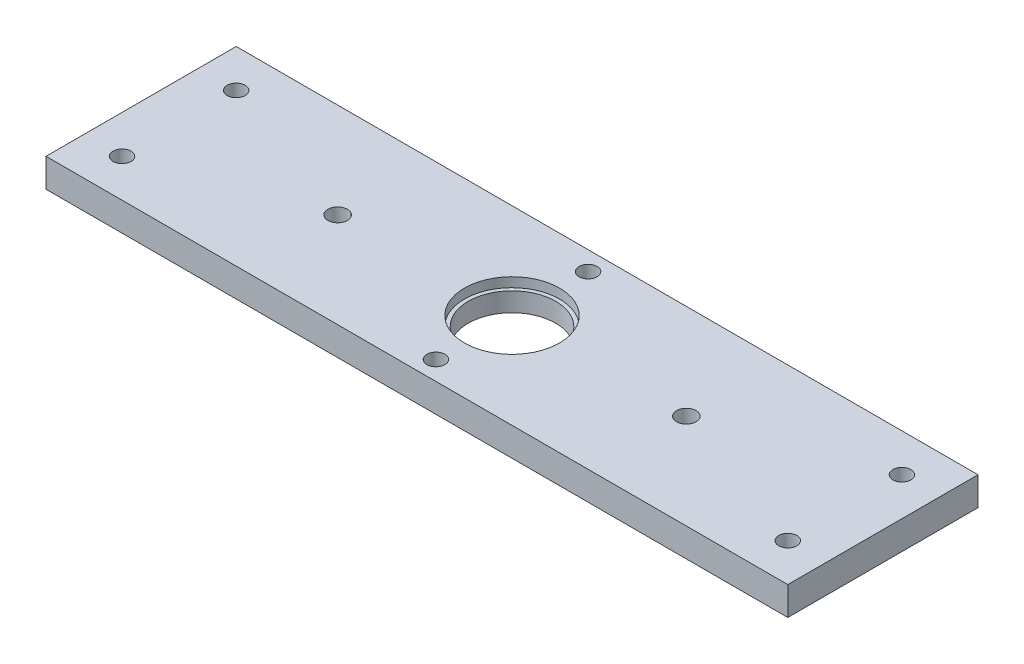
ISO-10303-21;
HEADER;
FILE_DESCRIPTION(('STEP AP214'),'2;1');
FILE_NAME('part.step','',(''),(''),'','','');
FILE_SCHEMA(('AUTOMOTIVE_DESIGN { 1 0 10303 214 1 1 1 1 }'));
ENDSEC;
DATA;
#1=APPLICATION_CONTEXT('core data for automotive mechanical design processes');
#2=APPLICATION_PROTOCOL_DEFINITION('international standard','automotive_design',2000,#1);
#3=PRODUCT_CONTEXT('',#1,'mechanical');
#4=PRODUCT('Part','Part','',(#3));
#5=PRODUCT_RELATED_PRODUCT_CATEGORY('part','',(#4));
#6=PRODUCT_DEFINITION_FORMATION('','',#4);
#7=PRODUCT_DEFINITION_CONTEXT('part definition',#1,'design');
#8=PRODUCT_DEFINITION('design','',#6,#7);
#9=PRODUCT_DEFINITION_SHAPE('','',#8);
#10=(LENGTH_UNIT() NAMED_UNIT(*) SI_UNIT(.MILLI.,.METRE.));
#11=(NAMED_UNIT(*) PLANE_ANGLE_UNIT() SI_UNIT($,.RADIAN.));
#12=(NAMED_UNIT(*) SI_UNIT($,.STERADIAN.) SOLID_ANGLE_UNIT());
#13=UNCERTAINTY_MEASURE_WITH_UNIT(LENGTH_MEASURE(1.E-05),#10,'distance_accuracy_value','');
#14=(GEOMETRIC_REPRESENTATION_CONTEXT(3) GLOBAL_UNCERTAINTY_ASSIGNED_CONTEXT((#13)) GLOBAL_UNIT_ASSIGNED_CONTEXT((#10,
#11,#12)) REPRESENTATION_CONTEXT('',''));
#15=CARTESIAN_POINT('',(0.,0.,0.));
#16=DIRECTION('',(0.,0.,1.));
#17=DIRECTION('',(1.,0.,0.));
#18=AXIS2_PLACEMENT_3D('',#15,#16,#17);
#19=CARTESIAN_POINT('',(0.,0.,0.));
#20=DIRECTION('',(0.,1.,0.));
#21=DIRECTION('',(0.,0.,1.));
#22=AXIS2_PLACEMENT_3D('',#19,#20,#21);
#23=CYLINDRICAL_SURFACE('',#22,14.605);
#24=CARTESIAN_POINT('',(0.,0.,0.));
#25=DIRECTION('',(0.,1.,0.));
#26=DIRECTION('',(0.,0.,1.));
#27=AXIS2_PLACEMENT_3D('',#24,#25,#26);
#28=CIRCLE('',#27,14.605);
#29=CARTESIAN_POINT('',(0.,0.,14.605));
#30=VERTEX_POINT('',#29);
#31=EDGE_CURVE('E104',#30,#30,#28,.T.);
#32=CARTESIAN_POINT('',(0.,6.35,0.));
#33=DIRECTION('',(0.,1.,0.));
#34=DIRECTION('',(0.,0.,1.));
#35=AXIS2_PLACEMENT_3D('',#32,#33,#34);
#36=CIRCLE('',#35,14.605);
#37=CARTESIAN_POINT('',(0.,6.35,14.605));
#38=VERTEX_POINT('',#37);
#39=EDGE_CURVE('E39',#38,#38,#36,.F.);
#40=CARTESIAN_POINT('',(0.,0.,14.605));
#41=CARTESIAN_POINT('',(0.,0.0661458333333333,14.605));
#42=CARTESIAN_POINT('',(0.,0.132291666666667,14.605));
#43=CARTESIAN_POINT('',(0.,0.264583333333333,14.605));
#44=CARTESIAN_POINT('',(0.,0.330729166666667,14.605));
#45=CARTESIAN_POINT('',(0.,0.463020833333333,14.605));
#46=CARTESIAN_POINT('',(0.,0.529166666666667,14.605));
#47=CARTESIAN_POINT('',(0.,0.661458333333333,14.605));
#48=CARTESIAN_POINT('',(0.,0.727604166666667,14.605));
#49=CARTESIAN_POINT('',(0.,0.859895833333333,14.605));
#50=CARTESIAN_POINT('',(0.,0.926041666666667,14.605));
#51=CARTESIAN_POINT('',(0.,1.05833333333333,14.605));
#52=CARTESIAN_POINT('',(0.,1.12447916666667,14.605));
#53=CARTESIAN_POINT('',(0.,1.25677083333333,14.605));
#54=CARTESIAN_POINT('',(0.,1.32291666666667,14.605));
#55=CARTESIAN_POINT('',(0.,1.45520833333333,14.605));
#56=CARTESIAN_POINT('',(0.,1.52135416666667,14.605));
#57=CARTESIAN_POINT('',(0.,1.65364583333333,14.605));
#58=CARTESIAN_POINT('',(0.,1.71979166666667,14.605));
#59=CARTESIAN_POINT('',(0.,1.85208333333333,14.605));
#60=CARTESIAN_POINT('',(0.,1.91822916666667,14.605));
#61=CARTESIAN_POINT('',(0.,2.05052083333333,14.605));
#62=CARTESIAN_POINT('',(0.,2.11666666666667,14.605));
#63=CARTESIAN_POINT('',(0.,2.24895833333333,14.605));
#64=CARTESIAN_POINT('',(0.,2.31510416666667,14.605));
#65=CARTESIAN_POINT('',(0.,2.44739583333333,14.605));
#66=CARTESIAN_POINT('',(0.,2.51354166666667,14.605));
#67=CARTESIAN_POINT('',(0.,2.64583333333333,14.605));
#68=CARTESIAN_POINT('',(0.,2.71197916666667,14.605));
#69=CARTESIAN_POINT('',(0.,2.84427083333333,14.605));
#70=CARTESIAN_POINT('',(0.,2.91041666666667,14.605));
#71=CARTESIAN_POINT('',(0.,3.04270833333333,14.605));
#72=CARTESIAN_POINT('',(0.,3.10885416666667,14.605));
#73=CARTESIAN_POINT('',(0.,3.24114583333333,14.605));
#74=CARTESIAN_POINT('',(0.,3.30729166666667,14.605));
#75=CARTESIAN_POINT('',(0.,3.43958333333333,14.605));
#76=CARTESIAN_POINT('',(0.,3.50572916666667,14.605));
#77=CARTESIAN_POINT('',(0.,3.63802083333333,14.605));
#78=CARTESIAN_POINT('',(0.,3.70416666666667,14.605));
#79=CARTESIAN_POINT('',(0.,3.83645833333333,14.605));
#80=CARTESIAN_POINT('',(0.,3.90260416666667,14.605));
#81=CARTESIAN_POINT('',(0.,4.03489583333333,14.605));
#82=CARTESIAN_POINT('',(0.,4.10104166666667,14.605));
#83=CARTESIAN_POINT('',(0.,4.23333333333333,14.605));
#84=CARTESIAN_POINT('',(0.,4.29947916666667,14.605));
#85=CARTESIAN_POINT('',(0.,4.43177083333333,14.605));
#86=CARTESIAN_POINT('',(0.,4.49791666666667,14.605));
#87=CARTESIAN_POINT('',(0.,4.63020833333333,14.605));
#88=CARTESIAN_POINT('',(0.,4.69635416666667,14.605));
#89=CARTESIAN_POINT('',(0.,4.82864583333333,14.605));
#90=CARTESIAN_POINT('',(0.,4.89479166666667,14.605));
#91=CARTESIAN_POINT('',(0.,5.02708333333333,14.605));
#92=CARTESIAN_POINT('',(0.,5.09322916666667,14.605));
#93=CARTESIAN_POINT('',(0.,5.22552083333333,14.605));
#94=CARTESIAN_POINT('',(0.,5.29166666666667,14.605));
#95=CARTESIAN_POINT('',(0.,5.42395833333333,14.605));
#96=CARTESIAN_POINT('',(0.,5.49010416666667,14.605));
#97=CARTESIAN_POINT('',(0.,5.62239583333333,14.605));
#98=CARTESIAN_POINT('',(0.,5.68854166666667,14.605));
#99=CARTESIAN_POINT('',(0.,5.82083333333333,14.605));
#100=CARTESIAN_POINT('',(0.,5.88697916666667,14.605));
#101=CARTESIAN_POINT('',(0.,6.01927083333333,14.605));
#102=CARTESIAN_POINT('',(0.,6.08541666666667,14.605));
#103=CARTESIAN_POINT('',(0.,6.21770833333333,14.605));
#104=CARTESIAN_POINT('',(0.,6.28385416666667,14.605));
#105=CARTESIAN_POINT('',(0.,6.35,14.605));
#106=B_SPLINE_CURVE_WITH_KNOTS('',3,(#40,#41,#42,#43,#44,#45,#46,#47,#48,#49,#50,#51,#52,#53,
#54,#55,#56,#57,#58,#59,#60,#61,#62,#63,#64,#65,#66,#67,#68,#69,#70,#71,#72,#73,#74,#75,#76,#77,
#78,#79,#80,#81,#82,#83,#84,#85,#86,#87,#88,#89,#90,#91,#92,#93,#94,#95,#96,#97,#98,#99,#100,
#101,#102,#103,#104,#105),.UNSPECIFIED.,.F.,.F.,(4,2,2,2,2,2,2,2,2,2,2,2,2,2,2,2,2,2,2,2,2,2,2,
2,2,2,2,2,2,2,2,2,4),(0.,0.1984375,0.396875,0.5953125,0.79375,0.9921875,1.190625,1.3890625,
1.5875,1.7859375,1.984375,2.1828125,2.38125,2.5796875,2.778125,2.9765625,3.175,3.3734375,
3.571875,3.7703125,3.96875,4.1671875,4.365625,4.5640625,4.7625,4.9609375,5.159375,5.3578125,
5.55625,5.7546875,5.953125,6.1515625,6.35),.UNSPECIFIED.);
#107=EDGE_CURVE('BSEAM35',#30,#38,#106,.T.);
#108=ORIENTED_EDGE('',*,*,#31,.F.);
#109=ORIENTED_EDGE('',*,*,#39,.F.);
#110=ORIENTED_EDGE('',*,*,#107,.T.);
#111=ORIENTED_EDGE('',*,*,#107,.F.);
#112=EDGE_LOOP('',(#108,#110,#109,#111));
#113=FACE_BOUND('',#112,.T.);
#114=ADVANCED_FACE('F35',(#113),#23,.F.);
#115=CARTESIAN_POINT('',(123.825,9.525,31.75));
#116=DIRECTION('',(-1.,0.,0.));
#117=DIRECTION('',(0.,0.,1.));
#118=AXIS2_PLACEMENT_3D('',#115,#116,#117);
#119=PLANE('',#118);
#120=DIRECTION('',(0.,0.,-1.));
#121=VECTOR('',#120,1.);
#122=CARTESIAN_POINT('',(123.825,0.,31.75));
#123=LINE('',#122,#121);
#124=CARTESIAN_POINT('',(123.825,0.,31.75));
#125=VERTEX_POINT('',#124);
#126=CARTESIAN_POINT('',(123.825,0.,-31.75));
#127=VERTEX_POINT('',#126);
#128=EDGE_CURVE('E101',#125,#127,#123,.T.);
#129=ORIENTED_EDGE('',*,*,#128,.T.);
#130=DIRECTION('',(0.,-1.,0.));
#131=VECTOR('',#130,1.);
#132=CARTESIAN_POINT('',(123.825,9.525,-31.75));
#133=LINE('',#132,#131);
#134=CARTESIAN_POINT('',(123.825,9.525,-31.75));
#135=VERTEX_POINT('',#134);
#136=EDGE_CURVE('E11',#135,#127,#133,.T.);
#137=ORIENTED_EDGE('',*,*,#136,.F.);
#138=DIRECTION('',(0.,0.,-1.));
#139=VECTOR('',#138,1.);
#140=CARTESIAN_POINT('',(123.825,9.525,31.75));
#141=LINE('',#140,#139);
#142=CARTESIAN_POINT('',(123.825,9.525,31.75));
#143=VERTEX_POINT('',#142);
#144=EDGE_CURVE('E88',#143,#135,#141,.T.);
#145=ORIENTED_EDGE('',*,*,#144,.F.);
#146=DIRECTION('',(0.,-1.,0.));
#147=VECTOR('',#146,1.);
#148=CARTESIAN_POINT('',(123.825,9.525,31.75));
#149=LINE('',#148,#147);
#150=EDGE_CURVE('E97',#143,#125,#149,.T.);
#151=ORIENTED_EDGE('',*,*,#150,.T.);
#152=EDGE_LOOP('',(#129,#137,#145,#151));
#153=FACE_BOUND('',#152,.T.);
#154=ADVANCED_FACE('F37',(#153),#119,.F.);
#155=CARTESIAN_POINT('',(-123.825,9.525,-31.75));
#156=DIRECTION('',(0.,0.,1.));
#157=DIRECTION('',(1.,0.,0.));
#158=AXIS2_PLACEMENT_3D('',#155,#156,#157);
#159=PLANE('',#158);
#160=DIRECTION('',(-1.,0.,0.));
#161=VECTOR('',#160,1.);
#162=CARTESIAN_POINT('',(-123.825,0.,-31.75));
#163=LINE('',#162,#161);
#164=CARTESIAN_POINT('',(-123.825,0.,-31.75));
#165=VERTEX_POINT('',#164);
#166=EDGE_CURVE('E92',#127,#165,#163,.T.);
#167=ORIENTED_EDGE('',*,*,#166,.T.);
#168=DIRECTION('',(0.,-1.,0.));
#169=VECTOR('',#168,1.);
#170=CARTESIAN_POINT('',(-123.825,9.525,-31.75));
#171=LINE('',#170,#169);
#172=CARTESIAN_POINT('',(-123.825,9.525,-31.75));
#173=VERTEX_POINT('',#172);
#174=EDGE_CURVE('E45',#173,#165,#171,.T.);
#175=ORIENTED_EDGE('',*,*,#174,.F.);
#176=DIRECTION('',(-1.,0.,0.));
#177=VECTOR('',#176,1.);
#178=CARTESIAN_POINT('',(-123.825,9.525,-31.75));
#179=LINE('',#178,#177);
#180=EDGE_CURVE('E83',#135,#173,#179,.T.);
#181=ORIENTED_EDGE('',*,*,#180,.F.);
#182=ORIENTED_EDGE('',*,*,#136,.T.);
#183=EDGE_LOOP('',(#167,#175,#181,#182));
#184=FACE_BOUND('',#183,.T.);
#185=ADVANCED_FACE('F91',(#184),#159,.F.);
#186=CARTESIAN_POINT('',(-123.825,9.525,31.75));
#187=DIRECTION('',(1.,0.,0.));
#188=DIRECTION('',(0.,0.,-1.));
#189=AXIS2_PLACEMENT_3D('',#186,#187,#188);
#190=PLANE('',#189);
#191=DIRECTION('',(0.,0.,1.));
#192=VECTOR('',#191,1.);
#193=CARTESIAN_POINT('',(-123.825,0.,31.75));
#194=LINE('',#193,#192);
#195=CARTESIAN_POINT('',(-123.825,0.,31.75));
#196=VERTEX_POINT('',#195);
#197=EDGE_CURVE('E70',#165,#196,#194,.T.);
#198=ORIENTED_EDGE('',*,*,#197,.T.);
#199=DIRECTION('',(0.,-1.,0.));
#200=VECTOR('',#199,1.);
#201=CARTESIAN_POINT('',(-123.825,9.525,31.75));
#202=LINE('',#201,#200);
#203=CARTESIAN_POINT('',(-123.825,9.525,31.75));
#204=VERTEX_POINT('',#203);
#205=EDGE_CURVE('E93',#204,#196,#202,.T.);
#206=ORIENTED_EDGE('',*,*,#205,.F.);
#207=DIRECTION('',(0.,0.,1.));
#208=VECTOR('',#207,1.);
#209=CARTESIAN_POINT('',(-123.825,9.525,31.75));
#210=LINE('',#209,#208);
#211=EDGE_CURVE('E86',#173,#204,#210,.T.);
#212=ORIENTED_EDGE('',*,*,#211,.F.);
#213=ORIENTED_EDGE('',*,*,#174,.T.);
#214=EDGE_LOOP('',(#198,#206,#212,#213));
#215=FACE_BOUND('',#214,.T.);
#216=ADVANCED_FACE('F95',(#215),#190,.F.);
#217=CARTESIAN_POINT('',(-123.825,9.525,31.75));
#218=DIRECTION('',(0.,0.,-1.));
#219=DIRECTION('',(-1.,0.,0.));
#220=AXIS2_PLACEMENT_3D('',#217,#218,#219);
#221=PLANE('',#220);
#222=DIRECTION('',(1.,0.,0.));
#223=VECTOR('',#222,1.);
#224=CARTESIAN_POINT('',(-123.825,0.,31.75));
#225=LINE('',#224,#223);
#226=EDGE_CURVE('E76',#196,#125,#225,.T.);
#227=ORIENTED_EDGE('',*,*,#226,.T.);
#228=ORIENTED_EDGE('',*,*,#150,.F.);
#229=DIRECTION('',(1.,0.,0.));
#230=VECTOR('',#229,1.);
#231=CARTESIAN_POINT('',(-123.825,9.525,31.75));
#232=LINE('',#231,#230);
#233=EDGE_CURVE('E53',#204,#143,#232,.T.);
#234=ORIENTED_EDGE('',*,*,#233,.F.);
#235=ORIENTED_EDGE('',*,*,#205,.T.);
#236=EDGE_LOOP('',(#227,#228,#234,#235));
#237=FACE_BOUND('',#236,.T.);
#238=ADVANCED_FACE('F109',(#237),#221,.F.);
#239=CARTESIAN_POINT('',(0.,9.525,0.));
#240=DIRECTION('',(0.,-1.,0.));
#241=DIRECTION('',(0.,0.,-1.));
#242=AXIS2_PLACEMENT_3D('',#239,#240,#241);
#243=PLANE('',#242);
#244=CARTESIAN_POINT('',(-111.125,9.525,-19.05));
#245=DIRECTION('',(0.,1.,0.));
#246=DIRECTION('',(0.,0.,1.));
#247=AXIS2_PLACEMENT_3D('',#244,#245,#246);
#248=CIRCLE('',#247,2.99999999999999);
#249=CARTESIAN_POINT('',(-111.125,9.525,-16.05));
#250=VERTEX_POINT('',#249);
#251=EDGE_CURVE('E168',#250,#250,#248,.T.);
#252=ORIENTED_EDGE('',*,*,#251,.F.);
#253=EDGE_LOOP('',(#252));
#254=FACE_BOUND('',#253,.T.);
#255=CARTESIAN_POINT('',(-111.125,9.525,19.05));
#256=DIRECTION('',(0.,1.,0.));
#257=DIRECTION('',(0.,0.,1.));
#258=AXIS2_PLACEMENT_3D('',#255,#256,#257);
#259=CIRCLE('',#258,2.99999999999999);
#260=CARTESIAN_POINT('',(-111.125,9.525,22.05));
#261=VERTEX_POINT('',#260);
#262=EDGE_CURVE('E162',#261,#261,#259,.T.);
#263=ORIENTED_EDGE('',*,*,#262,.F.);
#264=EDGE_LOOP('',(#263));
#265=FACE_BOUND('',#264,.T.);
#266=CARTESIAN_POINT('',(111.125,9.525,19.05));
#267=DIRECTION('',(0.,1.,0.));
#268=DIRECTION('',(0.,0.,1.));
#269=AXIS2_PLACEMENT_3D('',#266,#267,#268);
#270=CIRCLE('',#269,2.99999999999999);
#271=CARTESIAN_POINT('',(111.125,9.525,22.05));
#272=VERTEX_POINT('',#271);
#273=EDGE_CURVE('E156',#272,#272,#270,.T.);
#274=ORIENTED_EDGE('',*,*,#273,.F.);
#275=EDGE_LOOP('',(#274));
#276=FACE_BOUND('',#275,.T.);
#277=CARTESIAN_POINT('',(111.125,9.525,-19.05));
#278=DIRECTION('',(0.,1.,0.));
#279=DIRECTION('',(0.,0.,1.));
#280=AXIS2_PLACEMENT_3D('',#277,#278,#279);
#281=CIRCLE('',#280,2.99999999999999);
#282=CARTESIAN_POINT('',(111.125,9.525,-16.05));
#283=VERTEX_POINT('',#282);
#284=EDGE_CURVE('E150',#283,#283,#281,.T.);
#285=ORIENTED_EDGE('',*,*,#284,.F.);
#286=EDGE_LOOP('',(#285));
#287=FACE_BOUND('',#286,.T.);
#288=CARTESIAN_POINT('',(0.,9.525,0.));
#289=DIRECTION('',(0.,1.,0.));
#290=DIRECTION('',(0.,0.,1.));
#291=AXIS2_PLACEMENT_3D('',#288,#289,#290);
#292=CIRCLE('',#291,15.875);
#293=CARTESIAN_POINT('',(0.,9.525,15.875));
#294=VERTEX_POINT('',#293);
#295=EDGE_CURVE('E141',#294,#294,#292,.T.);
#296=ORIENTED_EDGE('',*,*,#295,.F.);
#297=EDGE_LOOP('',(#296));
#298=FACE_BOUND('',#297,.T.);
#299=CARTESIAN_POINT('',(-58.2083333333333,9.525,0.));
#300=DIRECTION('',(0.,-1.,0.));
#301=DIRECTION('',(0.,0.,-1.));
#302=AXIS2_PLACEMENT_3D('',#299,#300,#301);
#303=CIRCLE('',#302,3.25);
#304=CARTESIAN_POINT('',(-58.2083333333333,9.525,-3.25));
#305=VERTEX_POINT('',#304);
#306=EDGE_CURVE('E135',#305,#305,#303,.T.);
#307=ORIENTED_EDGE('',*,*,#306,.T.);
#308=EDGE_LOOP('',(#307));
#309=FACE_BOUND('',#308,.T.);
#310=CARTESIAN_POINT('',(58.2083333333333,9.525,0.));
#311=DIRECTION('',(0.,-1.,0.));
#312=DIRECTION('',(0.,0.,-1.));
#313=AXIS2_PLACEMENT_3D('',#310,#311,#312);
#314=CIRCLE('',#313,3.25);
#315=CARTESIAN_POINT('',(58.2083333333333,9.525,-3.25));
#316=VERTEX_POINT('',#315);
#317=EDGE_CURVE('E129',#316,#316,#314,.T.);
#318=ORIENTED_EDGE('',*,*,#317,.T.);
#319=EDGE_LOOP('',(#318));
#320=FACE_BOUND('',#319,.T.);
#321=CARTESIAN_POINT('',(0.,9.525,25.4));
#322=DIRECTION('',(0.,-1.,0.));
#323=DIRECTION('',(0.,0.,-1.));
#324=AXIS2_PLACEMENT_3D('',#321,#322,#323);
#325=CIRCLE('',#324,3.);
#326=CARTESIAN_POINT('',(0.,9.525,22.4));
#327=VERTEX_POINT('',#326);
#328=EDGE_CURVE('E123',#327,#327,#325,.T.);
#329=ORIENTED_EDGE('',*,*,#328,.T.);
#330=EDGE_LOOP('',(#329));
#331=FACE_BOUND('',#330,.T.);
#332=CARTESIAN_POINT('',(0.,9.525,-25.4));
#333=DIRECTION('',(0.,-1.,0.));
#334=DIRECTION('',(0.,0.,-1.));
#335=AXIS2_PLACEMENT_3D('',#332,#333,#334);
#336=CIRCLE('',#335,3.);
#337=CARTESIAN_POINT('',(0.,9.525,-28.4));
#338=VERTEX_POINT('',#337);
#339=EDGE_CURVE('E117',#338,#338,#336,.T.);
#340=ORIENTED_EDGE('',*,*,#339,.T.);
#341=EDGE_LOOP('',(#340));
#342=FACE_BOUND('',#341,.T.);
#343=ORIENTED_EDGE('',*,*,#144,.T.);
#344=ORIENTED_EDGE('',*,*,#180,.T.);
#345=ORIENTED_EDGE('',*,*,#211,.T.);
#346=ORIENTED_EDGE('',*,*,#233,.T.);
#347=EDGE_LOOP('',(#343,#344,#345,#346));
#348=FACE_BOUND('',#347,.T.);
#349=ADVANCED_FACE('F84',(#254,#265,#276,#287,#298,#309,#320,#331,#342,#348),#243,.F.);
#350=CARTESIAN_POINT('',(0.,0.,0.));
#351=DIRECTION('',(0.,-1.,0.));
#352=DIRECTION('',(0.,0.,-1.));
#353=AXIS2_PLACEMENT_3D('',#350,#351,#352);
#354=PLANE('',#353);
#355=CARTESIAN_POINT('',(-111.125,0.,-19.05));
#356=DIRECTION('',(0.,1.,0.));
#357=DIRECTION('',(0.,0.,1.));
#358=AXIS2_PLACEMENT_3D('',#355,#356,#357);
#359=CIRCLE('',#358,3.);
#360=CARTESIAN_POINT('',(-111.125,0.,-16.05));
#361=VERTEX_POINT('',#360);
#362=EDGE_CURVE('E165',#361,#361,#359,.T.);
#363=ORIENTED_EDGE('',*,*,#362,.T.);
#364=EDGE_LOOP('',(#363));
#365=FACE_BOUND('',#364,.T.);
#366=CARTESIAN_POINT('',(-111.125,0.,19.05));
#367=DIRECTION('',(0.,1.,0.));
#368=DIRECTION('',(0.,0.,1.));
#369=AXIS2_PLACEMENT_3D('',#366,#367,#368);
#370=CIRCLE('',#369,3.);
#371=CARTESIAN_POINT('',(-111.125,0.,22.05));
#372=VERTEX_POINT('',#371);
#373=EDGE_CURVE('E159',#372,#372,#370,.T.);
#374=ORIENTED_EDGE('',*,*,#373,.T.);
#375=EDGE_LOOP('',(#374));
#376=FACE_BOUND('',#375,.T.);
#377=CARTESIAN_POINT('',(111.125,0.,19.05));
#378=DIRECTION('',(0.,1.,0.));
#379=DIRECTION('',(0.,0.,1.));
#380=AXIS2_PLACEMENT_3D('',#377,#378,#379);
#381=CIRCLE('',#380,3.);
#382=CARTESIAN_POINT('',(111.125,0.,22.05));
#383=VERTEX_POINT('',#382);
#384=EDGE_CURVE('E153',#383,#383,#381,.T.);
#385=ORIENTED_EDGE('',*,*,#384,.T.);
#386=EDGE_LOOP('',(#385));
#387=FACE_BOUND('',#386,.T.);
#388=CARTESIAN_POINT('',(111.125,0.,-19.05));
#389=DIRECTION('',(0.,1.,0.));
#390=DIRECTION('',(0.,0.,1.));
#391=AXIS2_PLACEMENT_3D('',#388,#389,#390);
#392=CIRCLE('',#391,3.);
#393=CARTESIAN_POINT('',(111.125,0.,-16.05));
#394=VERTEX_POINT('',#393);
#395=EDGE_CURVE('E145',#394,#394,#392,.T.);
#396=ORIENTED_EDGE('',*,*,#395,.T.);
#397=EDGE_LOOP('',(#396));
#398=FACE_BOUND('',#397,.T.);
#399=CARTESIAN_POINT('',(-58.2083333333333,0.,0.));
#400=DIRECTION('',(0.,-1.,0.));
#401=DIRECTION('',(0.,0.,-1.));
#402=AXIS2_PLACEMENT_3D('',#399,#400,#401);
#403=CIRCLE('',#402,3.25);
#404=CARTESIAN_POINT('',(-58.2083333333333,0.,-3.25));
#405=VERTEX_POINT('',#404);
#406=EDGE_CURVE('E138',#405,#405,#403,.T.);
#407=ORIENTED_EDGE('',*,*,#406,.F.);
#408=EDGE_LOOP('',(#407));
#409=FACE_BOUND('',#408,.T.);
#410=CARTESIAN_POINT('',(58.2083333333333,0.,0.));
#411=DIRECTION('',(0.,-1.,0.));
#412=DIRECTION('',(0.,0.,-1.));
#413=AXIS2_PLACEMENT_3D('',#410,#411,#412);
#414=CIRCLE('',#413,3.25);
#415=CARTESIAN_POINT('',(58.2083333333333,0.,-3.25));
#416=VERTEX_POINT('',#415);
#417=EDGE_CURVE('E132',#416,#416,#414,.T.);
#418=ORIENTED_EDGE('',*,*,#417,.F.);
#419=EDGE_LOOP('',(#418));
#420=FACE_BOUND('',#419,.T.);
#421=CARTESIAN_POINT('',(0.,0.,25.4));
#422=DIRECTION('',(0.,-1.,0.));
#423=DIRECTION('',(0.,0.,-1.));
#424=AXIS2_PLACEMENT_3D('',#421,#422,#423);
#425=CIRCLE('',#424,3.);
#426=CARTESIAN_POINT('',(0.,0.,22.4));
#427=VERTEX_POINT('',#426);
#428=EDGE_CURVE('E126',#427,#427,#425,.T.);
#429=ORIENTED_EDGE('',*,*,#428,.F.);
#430=EDGE_LOOP('',(#429));
#431=FACE_BOUND('',#430,.T.);
#432=CARTESIAN_POINT('',(0.,0.,-25.4));
#433=DIRECTION('',(0.,-1.,0.));
#434=DIRECTION('',(0.,0.,-1.));
#435=AXIS2_PLACEMENT_3D('',#432,#433,#434);
#436=CIRCLE('',#435,3.);
#437=CARTESIAN_POINT('',(0.,0.,-28.4));
#438=VERTEX_POINT('',#437);
#439=EDGE_CURVE('E120',#438,#438,#436,.T.);
#440=ORIENTED_EDGE('',*,*,#439,.F.);
#441=EDGE_LOOP('',(#440));
#442=FACE_BOUND('',#441,.T.);
#443=ORIENTED_EDGE('',*,*,#31,.T.);
#444=EDGE_LOOP('',(#443));
#445=FACE_BOUND('',#444,.T.);
#446=ORIENTED_EDGE('',*,*,#128,.F.);
#447=ORIENTED_EDGE('',*,*,#226,.F.);
#448=ORIENTED_EDGE('',*,*,#197,.F.);
#449=ORIENTED_EDGE('',*,*,#166,.F.);
#450=EDGE_LOOP('',(#446,#447,#448,#449));
#451=FACE_BOUND('',#450,.T.);
#452=ADVANCED_FACE('F112',(#365,#376,#387,#398,#409,#420,#431,#442,#445,#451),#354,.T.);
#453=CARTESIAN_POINT('',(0.,0.,-25.4));
#454=DIRECTION('',(0.,-1.,0.));
#455=DIRECTION('',(0.,0.,-1.));
#456=AXIS2_PLACEMENT_3D('',#453,#454,#455);
#457=CYLINDRICAL_SURFACE('',#456,3.);
#458=ORIENTED_EDGE('',*,*,#339,.F.);
#459=EDGE_LOOP('',(#458));
#460=FACE_BOUND('',#459,.T.);
#461=ORIENTED_EDGE('',*,*,#439,.T.);
#462=EDGE_LOOP('',(#461));
#463=FACE_BOUND('',#462,.T.);
#464=ADVANCED_FACE('F193',(#460,#463),#457,.F.);
#465=CARTESIAN_POINT('',(0.,0.,25.4));
#466=DIRECTION('',(0.,-1.,0.));
#467=DIRECTION('',(0.,0.,-1.));
#468=AXIS2_PLACEMENT_3D('',#465,#466,#467);
#469=CYLINDRICAL_SURFACE('',#468,3.);
#470=ORIENTED_EDGE('',*,*,#328,.F.);
#471=EDGE_LOOP('',(#470));
#472=FACE_BOUND('',#471,.T.);
#473=ORIENTED_EDGE('',*,*,#428,.T.);
#474=EDGE_LOOP('',(#473));
#475=FACE_BOUND('',#474,.T.);
#476=ADVANCED_FACE('F196',(#472,#475),#469,.F.);
#477=CARTESIAN_POINT('',(58.2083333333333,0.,0.));
#478=DIRECTION('',(0.,-1.,0.));
#479=DIRECTION('',(0.,0.,-1.));
#480=AXIS2_PLACEMENT_3D('',#477,#478,#479);
#481=CYLINDRICAL_SURFACE('',#480,3.25);
#482=ORIENTED_EDGE('',*,*,#317,.F.);
#483=EDGE_LOOP('',(#482));
#484=FACE_BOUND('',#483,.T.);
#485=ORIENTED_EDGE('',*,*,#417,.T.);
#486=EDGE_LOOP('',(#485));
#487=FACE_BOUND('',#486,.T.);
#488=ADVANCED_FACE('F225',(#484,#487),#481,.F.);
#489=CARTESIAN_POINT('',(-58.2083333333333,0.,0.));
#490=DIRECTION('',(0.,-1.,0.));
#491=DIRECTION('',(0.,0.,-1.));
#492=AXIS2_PLACEMENT_3D('',#489,#490,#491);
#493=CYLINDRICAL_SURFACE('',#492,3.25);
#494=ORIENTED_EDGE('',*,*,#306,.F.);
#495=EDGE_LOOP('',(#494));
#496=FACE_BOUND('',#495,.T.);
#497=ORIENTED_EDGE('',*,*,#406,.T.);
#498=EDGE_LOOP('',(#497));
#499=FACE_BOUND('',#498,.T.);
#500=ADVANCED_FACE('F215',(#496,#499),#493,.F.);
#501=CARTESIAN_POINT('',(0.,6.35,0.));
#502=DIRECTION('',(0.,1.,0.));
#503=DIRECTION('',(0.,0.,1.));
#504=AXIS2_PLACEMENT_3D('',#501,#502,#503);
#505=PLANE('',#504);
#506=CARTESIAN_POINT('',(0.,6.35,0.));
#507=DIRECTION('',(0.,1.,0.));
#508=DIRECTION('',(0.,0.,1.));
#509=AXIS2_PLACEMENT_3D('',#506,#507,#508);
#510=CIRCLE('',#509,15.875);
#511=CARTESIAN_POINT('',(0.,6.35,15.875));
#512=VERTEX_POINT('',#511);
#513=EDGE_CURVE('E144',#512,#512,#510,.T.);
#514=ORIENTED_EDGE('',*,*,#513,.T.);
#515=EDGE_LOOP('',(#514));
#516=FACE_BOUND('',#515,.T.);
#517=ORIENTED_EDGE('',*,*,#39,.T.);
#518=EDGE_LOOP('',(#517));
#519=FACE_BOUND('',#518,.T.);
#520=ADVANCED_FACE('F212',(#516,#519),#505,.T.);
#521=CARTESIAN_POINT('',(0.,6.35,0.));
#522=DIRECTION('',(0.,1.,0.));
#523=DIRECTION('',(0.,0.,1.));
#524=AXIS2_PLACEMENT_3D('',#521,#522,#523);
#525=CYLINDRICAL_SURFACE('',#524,15.875);
#526=ORIENTED_EDGE('',*,*,#513,.F.);
#527=EDGE_LOOP('',(#526));
#528=FACE_BOUND('',#527,.T.);
#529=ORIENTED_EDGE('',*,*,#295,.T.);
#530=EDGE_LOOP('',(#529));
#531=FACE_BOUND('',#530,.T.);
#532=ADVANCED_FACE('F214',(#528,#531),#525,.F.);
#533=CARTESIAN_POINT('',(111.125,9.525,-19.05));
#534=DIRECTION('',(0.,1.,0.));
#535=DIRECTION('',(0.,0.,1.));
#536=AXIS2_PLACEMENT_3D('',#533,#534,#535);
#537=CYLINDRICAL_SURFACE('',#536,3.);
#538=ORIENTED_EDGE('',*,*,#395,.F.);
#539=EDGE_LOOP('',(#538));
#540=FACE_BOUND('',#539,.T.);
#541=ORIENTED_EDGE('',*,*,#284,.T.);
#542=EDGE_LOOP('',(#541));
#543=FACE_BOUND('',#542,.T.);
#544=ADVANCED_FACE('F222',(#540,#543),#537,.F.);
#545=CARTESIAN_POINT('',(111.125,9.525,19.05));
#546=DIRECTION('',(0.,1.,0.));
#547=DIRECTION('',(0.,0.,1.));
#548=AXIS2_PLACEMENT_3D('',#545,#546,#547);
#549=CYLINDRICAL_SURFACE('',#548,3.);
#550=ORIENTED_EDGE('',*,*,#384,.F.);
#551=EDGE_LOOP('',(#550));
#552=FACE_BOUND('',#551,.T.);
#553=ORIENTED_EDGE('',*,*,#273,.T.);
#554=EDGE_LOOP('',(#553));
#555=FACE_BOUND('',#554,.T.);
#556=ADVANCED_FACE('F287',(#552,#555),#549,.F.);
#557=CARTESIAN_POINT('',(-111.125,9.525,19.05));
#558=DIRECTION('',(0.,1.,0.));
#559=DIRECTION('',(0.,0.,1.));
#560=AXIS2_PLACEMENT_3D('',#557,#558,#559);
#561=CYLINDRICAL_SURFACE('',#560,3.);
#562=ORIENTED_EDGE('',*,*,#373,.F.);
#563=EDGE_LOOP('',(#562));
#564=FACE_BOUND('',#563,.T.);
#565=ORIENTED_EDGE('',*,*,#262,.T.);
#566=EDGE_LOOP('',(#565));
#567=FACE_BOUND('',#566,.T.);
#568=ADVANCED_FACE('F296',(#564,#567),#561,.F.);
#569=CARTESIAN_POINT('',(-111.125,9.525,-19.05));
#570=DIRECTION('',(0.,1.,0.));
#571=DIRECTION('',(0.,0.,1.));
#572=AXIS2_PLACEMENT_3D('',#569,#570,#571);
#573=CYLINDRICAL_SURFACE('',#572,3.);
#574=ORIENTED_EDGE('',*,*,#362,.F.);
#575=EDGE_LOOP('',(#574));
#576=FACE_BOUND('',#575,.T.);
#577=ORIENTED_EDGE('',*,*,#251,.T.);
#578=EDGE_LOOP('',(#577));
#579=FACE_BOUND('',#578,.T.);
#580=ADVANCED_FACE('F172',(#576,#579),#573,.F.);
#581=CLOSED_SHELL('',(#114,#154,#185,#216,#238,#349,#452,#464,#476,#488,#500,#520,#532,#544,
#556,#568,#580));
#582=MANIFOLD_SOLID_BREP('B2',#581);
#583=ADVANCED_BREP_SHAPE_REPRESENTATION('',(#18,#582),#14);
#584=SHAPE_DEFINITION_REPRESENTATION(#9,#583);
ENDSEC;
END-ISO-10303-21;
